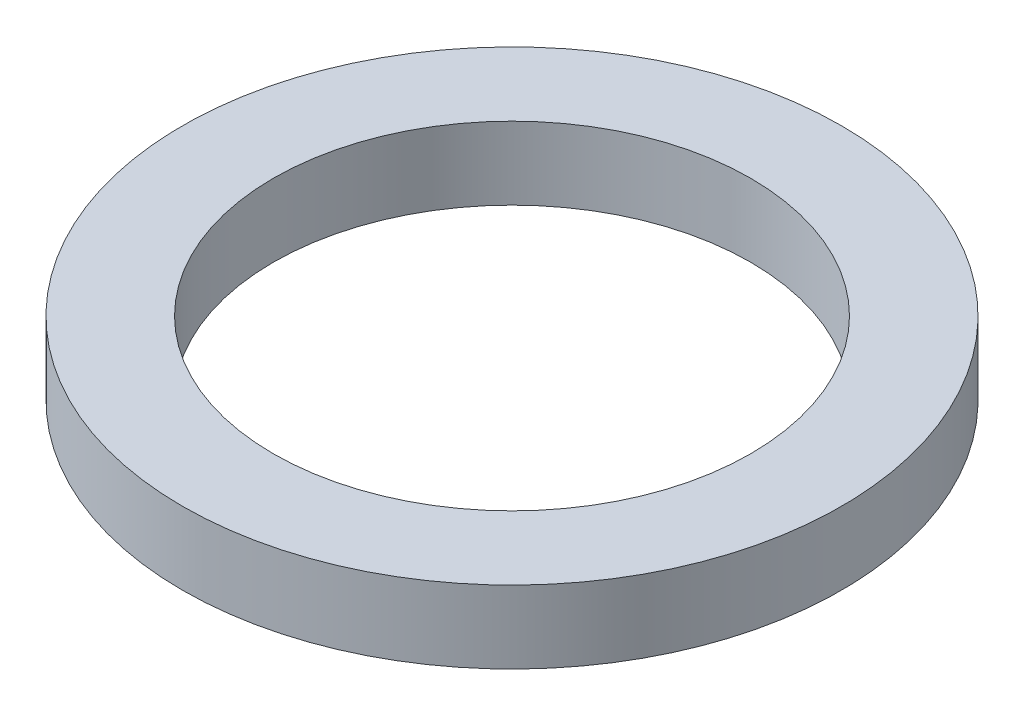
ISO-10303-21;
HEADER;
FILE_DESCRIPTION(('STEP AP214'),'2;1');
FILE_NAME('part.step','',(''),(''),'','','');
FILE_SCHEMA(('AUTOMOTIVE_DESIGN { 1 0 10303 214 1 1 1 1 }'));
ENDSEC;
DATA;
#1=APPLICATION_CONTEXT('core data for automotive mechanical design processes');
#2=APPLICATION_PROTOCOL_DEFINITION('international standard','automotive_design',2000,#1);
#3=PRODUCT_CONTEXT('',#1,'mechanical');
#4=PRODUCT('Part','Part','',(#3));
#5=PRODUCT_RELATED_PRODUCT_CATEGORY('part','',(#4));
#6=PRODUCT_DEFINITION_FORMATION('','',#4);
#7=PRODUCT_DEFINITION_CONTEXT('part definition',#1,'design');
#8=PRODUCT_DEFINITION('design','',#6,#7);
#9=PRODUCT_DEFINITION_SHAPE('','',#8);
#10=(LENGTH_UNIT() NAMED_UNIT(*) SI_UNIT(.MILLI.,.METRE.));
#11=(NAMED_UNIT(*) PLANE_ANGLE_UNIT() SI_UNIT($,.RADIAN.));
#12=(NAMED_UNIT(*) SI_UNIT($,.STERADIAN.) SOLID_ANGLE_UNIT());
#13=UNCERTAINTY_MEASURE_WITH_UNIT(LENGTH_MEASURE(1.E-05),#10,'distance_accuracy_value','');
#14=(GEOMETRIC_REPRESENTATION_CONTEXT(3) GLOBAL_UNCERTAINTY_ASSIGNED_CONTEXT((#13)) GLOBAL_UNIT_ASSIGNED_CONTEXT((#10,
#11,#12)) REPRESENTATION_CONTEXT('',''));
#15=CARTESIAN_POINT('',(0.,0.,0.));
#16=DIRECTION('',(0.,0.,1.));
#17=DIRECTION('',(1.,0.,0.));
#18=AXIS2_PLACEMENT_3D('',#15,#16,#17);
#19=CARTESIAN_POINT('',(0.,2.54,0.));
#20=DIRECTION('',(0.,1.,0.));
#21=DIRECTION('',(0.,0.,1.));
#22=AXIS2_PLACEMENT_3D('',#19,#20,#21);
#23=PLANE('',#22);
#24=CARTESIAN_POINT('',(0.,2.54,0.));
#25=DIRECTION('',(0.,1.,0.));
#26=DIRECTION('',(0.,0.,1.));
#27=AXIS2_PLACEMENT_3D('',#24,#25,#26);
#28=CIRCLE('',#27,11.509375);
#29=CARTESIAN_POINT('',(0.,2.54,11.509375));
#30=VERTEX_POINT('',#29);
#31=EDGE_CURVE('E10',#30,#30,#28,.T.);
#32=ORIENTED_EDGE('',*,*,#31,.T.);
#33=EDGE_LOOP('',(#32));
#34=FACE_BOUND('',#33,.T.);
#35=CARTESIAN_POINT('',(0.,2.54,0.));
#36=DIRECTION('',(0.,1.,0.));
#37=DIRECTION('',(0.,0.,1.));
#38=AXIS2_PLACEMENT_3D('',#35,#36,#37);
#39=CIRCLE('',#38,8.334375);
#40=CARTESIAN_POINT('',(0.,2.54,8.334375));
#41=VERTEX_POINT('',#40);
#42=EDGE_CURVE('E41',#41,#41,#39,.T.);
#43=ORIENTED_EDGE('',*,*,#42,.F.);
#44=EDGE_LOOP('',(#43));
#45=FACE_BOUND('',#44,.T.);
#46=ADVANCED_FACE('F30',(#34,#45),#23,.T.);
#47=CARTESIAN_POINT('',(0.,0.,0.));
#48=DIRECTION('',(0.,1.,0.));
#49=DIRECTION('',(0.,0.,1.));
#50=AXIS2_PLACEMENT_3D('',#47,#48,#49);
#51=PLANE('',#50);
#52=CARTESIAN_POINT('',(0.,0.,0.));
#53=DIRECTION('',(0.,1.,0.));
#54=DIRECTION('',(0.,0.,1.));
#55=AXIS2_PLACEMENT_3D('',#52,#53,#54);
#56=CIRCLE('',#55,11.509375);
#57=CARTESIAN_POINT('',(0.,0.,11.509375));
#58=VERTEX_POINT('',#57);
#59=EDGE_CURVE('E34',#58,#58,#56,.T.);
#60=ORIENTED_EDGE('',*,*,#59,.F.);
#61=EDGE_LOOP('',(#60));
#62=FACE_BOUND('',#61,.T.);
#63=CARTESIAN_POINT('',(0.,0.,0.));
#64=DIRECTION('',(0.,1.,0.));
#65=DIRECTION('',(0.,0.,1.));
#66=AXIS2_PLACEMENT_3D('',#63,#64,#65);
#67=CIRCLE('',#66,8.334375);
#68=CARTESIAN_POINT('',(0.,0.,8.334375));
#69=VERTEX_POINT('',#68);
#70=EDGE_CURVE('E43',#69,#69,#67,.T.);
#71=ORIENTED_EDGE('',*,*,#70,.T.);
#72=EDGE_LOOP('',(#71));
#73=FACE_BOUND('',#72,.T.);
#74=ADVANCED_FACE('F53',(#62,#73),#51,.F.);
#75=CARTESIAN_POINT('',(0.,2.54,0.));
#76=DIRECTION('',(0.,-1.,0.));
#77=DIRECTION('',(0.,0.,-1.));
#78=AXIS2_PLACEMENT_3D('',#75,#76,#77);
#79=CYLINDRICAL_SURFACE('',#78,11.509375);
#80=ORIENTED_EDGE('',*,*,#31,.F.);
#81=EDGE_LOOP('',(#80));
#82=FACE_BOUND('',#81,.T.);
#83=ORIENTED_EDGE('',*,*,#59,.T.);
#84=EDGE_LOOP('',(#83));
#85=FACE_BOUND('',#84,.T.);
#86=ADVANCED_FACE('F32',(#82,#85),#79,.T.);
#87=CARTESIAN_POINT('',(0.,2.54,0.));
#88=DIRECTION('',(0.,-1.,0.));
#89=DIRECTION('',(0.,0.,-1.));
#90=AXIS2_PLACEMENT_3D('',#87,#88,#89);
#91=CYLINDRICAL_SURFACE('',#90,8.334375);
#92=ORIENTED_EDGE('',*,*,#42,.T.);
#93=EDGE_LOOP('',(#92));
#94=FACE_BOUND('',#93,.T.);
#95=ORIENTED_EDGE('',*,*,#70,.F.);
#96=EDGE_LOOP('',(#95));
#97=FACE_BOUND('',#96,.T.);
#98=ADVANCED_FACE('F49',(#94,#97),#91,.F.);
#99=CLOSED_SHELL('',(#46,#74,#86,#98));
#100=MANIFOLD_SOLID_BREP('B2',#99);
#101=ADVANCED_BREP_SHAPE_REPRESENTATION('',(#18,#100),#14);
#102=SHAPE_DEFINITION_REPRESENTATION(#9,#101);
ENDSEC;
END-ISO-10303-21;
